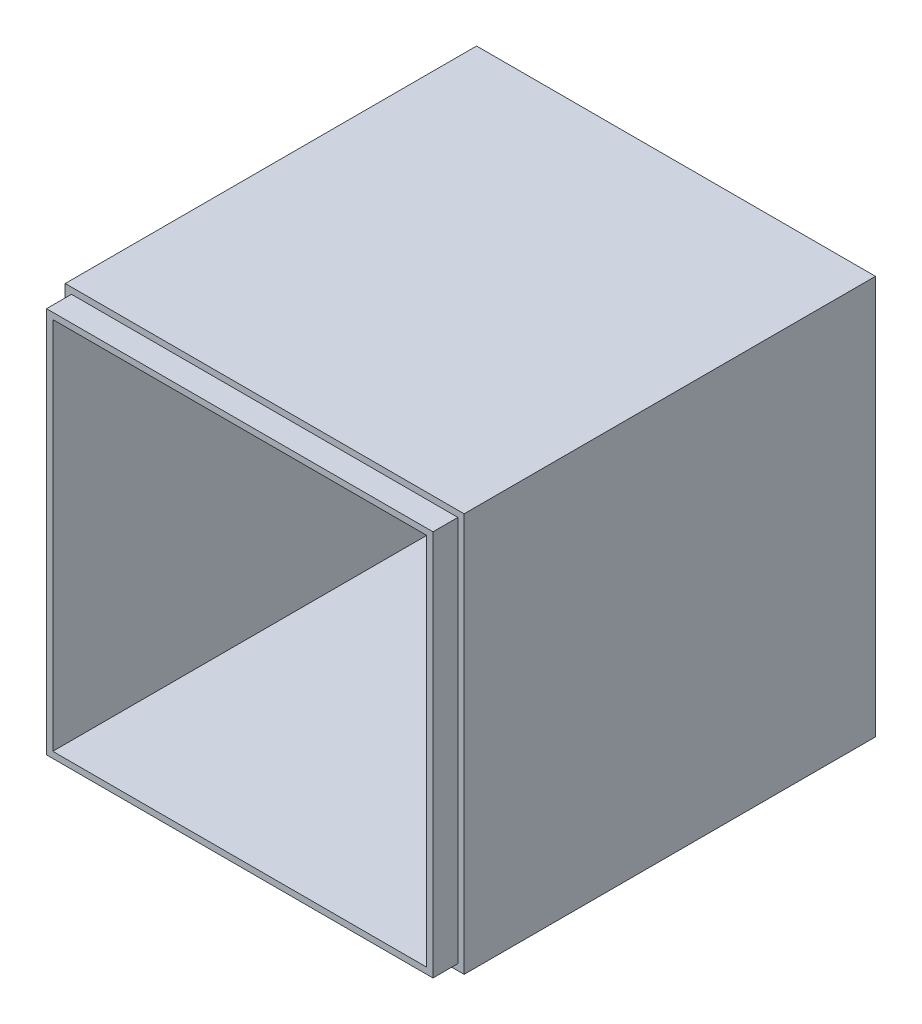
ISO-10303-21;
HEADER;
FILE_DESCRIPTION(('STEP AP214'),'2;1');
FILE_NAME('part.step','',(''),(''),'','','');
FILE_SCHEMA(('AUTOMOTIVE_DESIGN { 1 0 10303 214 1 1 1 1 }'));
ENDSEC;
DATA;
#1=APPLICATION_CONTEXT('core data for automotive mechanical design processes');
#2=APPLICATION_PROTOCOL_DEFINITION('international standard','automotive_design',2000,#1);
#3=PRODUCT_CONTEXT('',#1,'mechanical');
#4=PRODUCT('Part','Part','',(#3));
#5=PRODUCT_RELATED_PRODUCT_CATEGORY('part','',(#4));
#6=PRODUCT_DEFINITION_FORMATION('','',#4);
#7=PRODUCT_DEFINITION_CONTEXT('part definition',#1,'design');
#8=PRODUCT_DEFINITION('design','',#6,#7);
#9=PRODUCT_DEFINITION_SHAPE('','',#8);
#10=(LENGTH_UNIT() NAMED_UNIT(*) SI_UNIT(.MILLI.,.METRE.));
#11=(NAMED_UNIT(*) PLANE_ANGLE_UNIT() SI_UNIT($,.RADIAN.));
#12=(NAMED_UNIT(*) SI_UNIT($,.STERADIAN.) SOLID_ANGLE_UNIT());
#13=UNCERTAINTY_MEASURE_WITH_UNIT(LENGTH_MEASURE(1.E-05),#10,'distance_accuracy_value','');
#14=(GEOMETRIC_REPRESENTATION_CONTEXT(3) GLOBAL_UNCERTAINTY_ASSIGNED_CONTEXT((#13)) GLOBAL_UNIT_ASSIGNED_CONTEXT((#10,
#11,#12)) REPRESENTATION_CONTEXT('',''));
#15=CARTESIAN_POINT('',(0.,0.,0.));
#16=DIRECTION('',(0.,0.,1.));
#17=DIRECTION('',(1.,0.,0.));
#18=AXIS2_PLACEMENT_3D('',#15,#16,#17);
#19=CARTESIAN_POINT('',(0.,0.,88.9));
#20=DIRECTION('',(0.,0.,1.));
#21=DIRECTION('',(1.,0.,0.));
#22=AXIS2_PLACEMENT_3D('',#19,#20,#21);
#23=PLANE('',#22);
#24=DIRECTION('',(0.,1.,0.));
#25=VECTOR('',#24,1.);
#26=CARTESIAN_POINT('',(38.1,40.64,88.9));
#27=LINE('',#26,#25);
#28=CARTESIAN_POINT('',(38.1,-38.1,88.9));
#29=VERTEX_POINT('',#28);
#30=CARTESIAN_POINT('',(38.1,38.1,88.9));
#31=VERTEX_POINT('',#30);
#32=EDGE_CURVE('E191',#29,#31,#27,.T.);
#33=ORIENTED_EDGE('',*,*,#32,.F.);
#34=DIRECTION('',(1.,0.,0.));
#35=VECTOR('',#34,1.);
#36=CARTESIAN_POINT('',(-40.64,-38.1,88.9));
#37=LINE('',#36,#35);
#38=CARTESIAN_POINT('',(-38.1,-38.1,88.9));
#39=VERTEX_POINT('',#38);
#40=EDGE_CURVE('E181',#39,#29,#37,.T.);
#41=ORIENTED_EDGE('',*,*,#40,.F.);
#42=DIRECTION('',(0.,-1.,0.));
#43=VECTOR('',#42,1.);
#44=CARTESIAN_POINT('',(-38.1,40.64,88.9));
#45=LINE('',#44,#43);
#46=CARTESIAN_POINT('',(-38.1,38.1,88.9));
#47=VERTEX_POINT('',#46);
#48=EDGE_CURVE('E195',#47,#39,#45,.T.);
#49=ORIENTED_EDGE('',*,*,#48,.F.);
#50=DIRECTION('',(-1.,0.,0.));
#51=VECTOR('',#50,1.);
#52=CARTESIAN_POINT('',(-40.64,38.1,88.9));
#53=LINE('',#52,#51);
#54=EDGE_CURVE('E193',#31,#47,#53,.T.);
#55=ORIENTED_EDGE('',*,*,#54,.F.);
#56=EDGE_LOOP('',(#33,#41,#49,#55));
#57=FACE_BOUND('',#56,.T.);
#58=DIRECTION('',(0.,-1.,0.));
#59=VECTOR('',#58,1.);
#60=CARTESIAN_POINT('',(-39.37,39.37,88.9));
#61=LINE('',#60,#59);
#62=CARTESIAN_POINT('',(-39.37,39.37,88.9));
#63=VERTEX_POINT('',#62);
#64=CARTESIAN_POINT('',(-39.37,-39.37,88.9));
#65=VERTEX_POINT('',#64);
#66=EDGE_CURVE('E148',#63,#65,#61,.T.);
#67=ORIENTED_EDGE('',*,*,#66,.T.);
#68=DIRECTION('',(1.,0.,0.));
#69=VECTOR('',#68,1.);
#70=CARTESIAN_POINT('',(-39.37,-39.37,88.9));
#71=LINE('',#70,#69);
#72=CARTESIAN_POINT('',(39.37,-39.37,88.9));
#73=VERTEX_POINT('',#72);
#74=EDGE_CURVE('E155',#65,#73,#71,.T.);
#75=ORIENTED_EDGE('',*,*,#74,.T.);
#76=DIRECTION('',(0.,1.,0.));
#77=VECTOR('',#76,1.);
#78=CARTESIAN_POINT('',(39.37,-39.37,88.9));
#79=LINE('',#78,#77);
#80=CARTESIAN_POINT('',(39.37,39.37,88.9));
#81=VERTEX_POINT('',#80);
#82=EDGE_CURVE('E129',#73,#81,#79,.T.);
#83=ORIENTED_EDGE('',*,*,#82,.T.);
#84=DIRECTION('',(-1.,0.,0.));
#85=VECTOR('',#84,1.);
#86=CARTESIAN_POINT('',(39.37,39.37,88.9));
#87=LINE('',#86,#85);
#88=EDGE_CURVE('E57',#81,#63,#87,.T.);
#89=ORIENTED_EDGE('',*,*,#88,.T.);
#90=EDGE_LOOP('',(#67,#75,#83,#89));
#91=FACE_BOUND('',#90,.T.);
#92=ADVANCED_FACE('F35',(#57,#91),#23,.T.);
#93=CARTESIAN_POINT('',(38.1,40.64,88.9));
#94=DIRECTION('',(-1.,0.,0.));
#95=DIRECTION('',(0.,-1.,0.));
#96=AXIS2_PLACEMENT_3D('',#93,#94,#95);
#97=PLANE('',#96);
#98=DIRECTION('',(0.,1.,0.));
#99=VECTOR('',#98,1.);
#100=CARTESIAN_POINT('',(38.1,40.64,2.54));
#101=LINE('',#100,#99);
#102=CARTESIAN_POINT('',(38.1,-38.1,2.54));
#103=VERTEX_POINT('',#102);
#104=CARTESIAN_POINT('',(38.1,38.1,2.54));
#105=VERTEX_POINT('',#104);
#106=EDGE_CURVE('E168',#103,#105,#101,.T.);
#107=ORIENTED_EDGE('',*,*,#106,.F.);
#108=DIRECTION('',(0.,0.,-1.));
#109=VECTOR('',#108,1.);
#110=CARTESIAN_POINT('',(38.1,-38.1,88.9));
#111=LINE('',#110,#109);
#112=EDGE_CURVE('E177',#29,#103,#111,.T.);
#113=ORIENTED_EDGE('',*,*,#112,.F.);
#114=ORIENTED_EDGE('',*,*,#32,.T.);
#115=DIRECTION('',(0.,0.,-1.));
#116=VECTOR('',#115,1.);
#117=CARTESIAN_POINT('',(38.1,38.1,88.9));
#118=LINE('',#117,#116);
#119=EDGE_CURVE('E172',#31,#105,#118,.T.);
#120=ORIENTED_EDGE('',*,*,#119,.T.);
#121=EDGE_LOOP('',(#107,#113,#114,#120));
#122=FACE_BOUND('',#121,.T.);
#123=ADVANCED_FACE('F242',(#122),#97,.T.);
#124=CARTESIAN_POINT('',(-40.64,38.1,88.9));
#125=DIRECTION('',(0.,-1.,0.));
#126=DIRECTION('',(0.,0.,-1.));
#127=AXIS2_PLACEMENT_3D('',#124,#125,#126);
#128=PLANE('',#127);
#129=DIRECTION('',(-1.,0.,0.));
#130=VECTOR('',#129,1.);
#131=CARTESIAN_POINT('',(-40.64,38.1,2.54));
#132=LINE('',#131,#130);
#133=CARTESIAN_POINT('',(-38.1,38.1,2.54));
#134=VERTEX_POINT('',#133);
#135=EDGE_CURVE('E171',#105,#134,#132,.T.);
#136=ORIENTED_EDGE('',*,*,#135,.F.);
#137=ORIENTED_EDGE('',*,*,#119,.F.);
#138=ORIENTED_EDGE('',*,*,#54,.T.);
#139=DIRECTION('',(0.,0.,-1.));
#140=VECTOR('',#139,1.);
#141=CARTESIAN_POINT('',(-38.1,38.1,88.9));
#142=LINE('',#141,#140);
#143=EDGE_CURVE('E176',#47,#134,#142,.T.);
#144=ORIENTED_EDGE('',*,*,#143,.T.);
#145=EDGE_LOOP('',(#136,#137,#138,#144));
#146=FACE_BOUND('',#145,.T.);
#147=ADVANCED_FACE('F248',(#146),#128,.T.);
#148=CARTESIAN_POINT('',(-38.1,40.64,88.9));
#149=DIRECTION('',(1.,0.,0.));
#150=DIRECTION('',(0.,1.,0.));
#151=AXIS2_PLACEMENT_3D('',#148,#149,#150);
#152=PLANE('',#151);
#153=DIRECTION('',(0.,-1.,0.));
#154=VECTOR('',#153,1.);
#155=CARTESIAN_POINT('',(-38.1,40.64,2.54));
#156=LINE('',#155,#154);
#157=CARTESIAN_POINT('',(-38.1,-38.1,2.54));
#158=VERTEX_POINT('',#157);
#159=EDGE_CURVE('E183',#134,#158,#156,.T.);
#160=ORIENTED_EDGE('',*,*,#159,.F.);
#161=ORIENTED_EDGE('',*,*,#143,.F.);
#162=ORIENTED_EDGE('',*,*,#48,.T.);
#163=DIRECTION('',(0.,0.,-1.));
#164=VECTOR('',#163,1.);
#165=CARTESIAN_POINT('',(-38.1,-38.1,88.9));
#166=LINE('',#165,#164);
#167=EDGE_CURVE('E180',#39,#158,#166,.T.);
#168=ORIENTED_EDGE('',*,*,#167,.T.);
#169=EDGE_LOOP('',(#160,#161,#162,#168));
#170=FACE_BOUND('',#169,.T.);
#171=ADVANCED_FACE('F276',(#170),#152,.T.);
#172=CARTESIAN_POINT('',(-40.64,-38.1,88.9));
#173=DIRECTION('',(0.,1.,0.));
#174=DIRECTION('',(0.,0.,1.));
#175=AXIS2_PLACEMENT_3D('',#172,#173,#174);
#176=PLANE('',#175);
#177=DIRECTION('',(1.,0.,0.));
#178=VECTOR('',#177,1.);
#179=CARTESIAN_POINT('',(-40.64,-38.1,2.54));
#180=LINE('',#179,#178);
#181=EDGE_CURVE('E187',#158,#103,#180,.T.);
#182=ORIENTED_EDGE('',*,*,#181,.F.);
#183=ORIENTED_EDGE('',*,*,#167,.F.);
#184=ORIENTED_EDGE('',*,*,#40,.T.);
#185=ORIENTED_EDGE('',*,*,#112,.T.);
#186=EDGE_LOOP('',(#182,#183,#184,#185));
#187=FACE_BOUND('',#186,.T.);
#188=ADVANCED_FACE('F279',(#187),#176,.T.);
#189=CARTESIAN_POINT('',(0.,0.,2.54));
#190=DIRECTION('',(0.,0.,1.));
#191=DIRECTION('',(1.,0.,0.));
#192=AXIS2_PLACEMENT_3D('',#189,#190,#191);
#193=PLANE('',#192);
#194=ORIENTED_EDGE('',*,*,#106,.T.);
#195=ORIENTED_EDGE('',*,*,#135,.T.);
#196=ORIENTED_EDGE('',*,*,#159,.T.);
#197=ORIENTED_EDGE('',*,*,#181,.T.);
#198=EDGE_LOOP('',(#194,#195,#196,#197));
#199=FACE_BOUND('',#198,.T.);
#200=ADVANCED_FACE('F255',(#199),#193,.T.);
#201=CARTESIAN_POINT('',(0.,0.,83.82));
#202=DIRECTION('',(0.,0.,1.));
#203=DIRECTION('',(1.,0.,0.));
#204=AXIS2_PLACEMENT_3D('',#201,#202,#203);
#205=PLANE('',#204);
#206=DIRECTION('',(0.,-1.,0.));
#207=VECTOR('',#206,1.);
#208=CARTESIAN_POINT('',(-39.37,39.37,83.82));
#209=LINE('',#208,#207);
#210=CARTESIAN_POINT('',(-39.37,39.37,83.82));
#211=VERTEX_POINT('',#210);
#212=CARTESIAN_POINT('',(-39.37,-39.37,83.82));
#213=VERTEX_POINT('',#212);
#214=EDGE_CURVE('E135',#211,#213,#209,.T.);
#215=ORIENTED_EDGE('',*,*,#214,.F.);
#216=DIRECTION('',(-1.,0.,0.));
#217=VECTOR('',#216,1.);
#218=CARTESIAN_POINT('',(39.37,39.37,83.82));
#219=LINE('',#218,#217);
#220=CARTESIAN_POINT('',(39.37,39.37,83.82));
#221=VERTEX_POINT('',#220);
#222=EDGE_CURVE('E144',#221,#211,#219,.T.);
#223=ORIENTED_EDGE('',*,*,#222,.F.);
#224=DIRECTION('',(0.,1.,0.));
#225=VECTOR('',#224,1.);
#226=CARTESIAN_POINT('',(39.37,-39.37,83.82));
#227=LINE('',#226,#225);
#228=CARTESIAN_POINT('',(39.37,-39.37,83.82));
#229=VERTEX_POINT('',#228);
#230=EDGE_CURVE('E127',#229,#221,#227,.T.);
#231=ORIENTED_EDGE('',*,*,#230,.F.);
#232=DIRECTION('',(1.,0.,0.));
#233=VECTOR('',#232,1.);
#234=CARTESIAN_POINT('',(-39.37,-39.37,83.82));
#235=LINE('',#234,#233);
#236=EDGE_CURVE('E141',#213,#229,#235,.T.);
#237=ORIENTED_EDGE('',*,*,#236,.F.);
#238=EDGE_LOOP('',(#215,#223,#231,#237));
#239=FACE_BOUND('',#238,.T.);
#240=DIRECTION('',(0.,1.,0.));
#241=VECTOR('',#240,1.);
#242=CARTESIAN_POINT('',(40.64,40.64,83.82));
#243=LINE('',#242,#241);
#244=CARTESIAN_POINT('',(40.64,-40.64,83.82));
#245=VERTEX_POINT('',#244);
#246=CARTESIAN_POINT('',(40.64,40.64,83.82));
#247=VERTEX_POINT('',#246);
#248=EDGE_CURVE('E166',#245,#247,#243,.T.);
#249=ORIENTED_EDGE('',*,*,#248,.T.);
#250=DIRECTION('',(-1.,0.,0.));
#251=VECTOR('',#250,1.);
#252=CARTESIAN_POINT('',(-40.64,40.64,83.82));
#253=LINE('',#252,#251);
#254=CARTESIAN_POINT('',(-40.64,40.64,83.82));
#255=VERTEX_POINT('',#254);
#256=EDGE_CURVE('E164',#247,#255,#253,.T.);
#257=ORIENTED_EDGE('',*,*,#256,.T.);
#258=DIRECTION('',(0.,-1.,0.));
#259=VECTOR('',#258,1.);
#260=CARTESIAN_POINT('',(-40.64,40.64,83.82));
#261=LINE('',#260,#259);
#262=CARTESIAN_POINT('',(-40.64,-40.64,83.82));
#263=VERTEX_POINT('',#262);
#264=EDGE_CURVE('E49',#255,#263,#261,.T.);
#265=ORIENTED_EDGE('',*,*,#264,.T.);
#266=DIRECTION('',(1.,0.,0.));
#267=VECTOR('',#266,1.);
#268=CARTESIAN_POINT('',(-40.64,-40.64,83.82));
#269=LINE('',#268,#267);
#270=EDGE_CURVE('E11',#263,#245,#269,.T.);
#271=ORIENTED_EDGE('',*,*,#270,.T.);
#272=EDGE_LOOP('',(#249,#257,#265,#271));
#273=FACE_BOUND('',#272,.T.);
#274=ADVANCED_FACE('F140',(#239,#273),#205,.T.);
#275=CARTESIAN_POINT('',(-39.37,-39.37,83.82));
#276=DIRECTION('',(0.,-1.,0.));
#277=DIRECTION('',(0.,0.,-1.));
#278=AXIS2_PLACEMENT_3D('',#275,#276,#277);
#279=PLANE('',#278);
#280=ORIENTED_EDGE('',*,*,#74,.F.);
#281=DIRECTION('',(0.,0.,1.));
#282=VECTOR('',#281,1.);
#283=CARTESIAN_POINT('',(-39.37,-39.37,83.82));
#284=LINE('',#283,#282);
#285=EDGE_CURVE('E147',#213,#65,#284,.T.);
#286=ORIENTED_EDGE('',*,*,#285,.F.);
#287=ORIENTED_EDGE('',*,*,#236,.T.);
#288=DIRECTION('',(0.,0.,1.));
#289=VECTOR('',#288,1.);
#290=CARTESIAN_POINT('',(39.37,-39.37,83.82));
#291=LINE('',#290,#289);
#292=EDGE_CURVE('E124',#229,#73,#291,.T.);
#293=ORIENTED_EDGE('',*,*,#292,.T.);
#294=EDGE_LOOP('',(#280,#286,#287,#293));
#295=FACE_BOUND('',#294,.T.);
#296=ADVANCED_FACE('F146',(#295),#279,.T.);
#297=CARTESIAN_POINT('',(-39.37,39.37,83.82));
#298=DIRECTION('',(-1.,0.,0.));
#299=DIRECTION('',(0.,-1.,0.));
#300=AXIS2_PLACEMENT_3D('',#297,#298,#299);
#301=PLANE('',#300);
#302=ORIENTED_EDGE('',*,*,#66,.F.);
#303=DIRECTION('',(0.,0.,1.));
#304=VECTOR('',#303,1.);
#305=CARTESIAN_POINT('',(-39.37,39.37,83.82));
#306=LINE('',#305,#304);
#307=EDGE_CURVE('E160',#211,#63,#306,.T.);
#308=ORIENTED_EDGE('',*,*,#307,.F.);
#309=ORIENTED_EDGE('',*,*,#214,.T.);
#310=ORIENTED_EDGE('',*,*,#285,.T.);
#311=EDGE_LOOP('',(#302,#308,#309,#310));
#312=FACE_BOUND('',#311,.T.);
#313=ADVANCED_FACE('F266',(#312),#301,.T.);
#314=CARTESIAN_POINT('',(39.37,39.37,83.82));
#315=DIRECTION('',(0.,1.,0.));
#316=DIRECTION('',(0.,0.,1.));
#317=AXIS2_PLACEMENT_3D('',#314,#315,#316);
#318=PLANE('',#317);
#319=ORIENTED_EDGE('',*,*,#88,.F.);
#320=DIRECTION('',(0.,0.,1.));
#321=VECTOR('',#320,1.);
#322=CARTESIAN_POINT('',(39.37,39.37,83.82));
#323=LINE('',#322,#321);
#324=EDGE_CURVE('E134',#221,#81,#323,.T.);
#325=ORIENTED_EDGE('',*,*,#324,.F.);
#326=ORIENTED_EDGE('',*,*,#222,.T.);
#327=ORIENTED_EDGE('',*,*,#307,.T.);
#328=EDGE_LOOP('',(#319,#325,#326,#327));
#329=FACE_BOUND('',#328,.T.);
#330=ADVANCED_FACE('F261',(#329),#318,.T.);
#331=CARTESIAN_POINT('',(39.37,-39.37,83.82));
#332=DIRECTION('',(1.,0.,0.));
#333=DIRECTION('',(0.,1.,0.));
#334=AXIS2_PLACEMENT_3D('',#331,#332,#333);
#335=PLANE('',#334);
#336=ORIENTED_EDGE('',*,*,#82,.F.);
#337=ORIENTED_EDGE('',*,*,#292,.F.);
#338=ORIENTED_EDGE('',*,*,#230,.T.);
#339=ORIENTED_EDGE('',*,*,#324,.T.);
#340=EDGE_LOOP('',(#336,#337,#338,#339));
#341=FACE_BOUND('',#340,.T.);
#342=ADVANCED_FACE('F126',(#341),#335,.T.);
#343=CARTESIAN_POINT('',(0.,0.,0.));
#344=DIRECTION('',(0.,0.,1.));
#345=DIRECTION('',(1.,0.,0.));
#346=AXIS2_PLACEMENT_3D('',#343,#344,#345);
#347=PLANE('',#346);
#348=DIRECTION('',(0.,1.,0.));
#349=VECTOR('',#348,1.);
#350=CARTESIAN_POINT('',(40.64,40.64,0.));
#351=LINE('',#350,#349);
#352=CARTESIAN_POINT('',(40.64,-40.64,0.));
#353=VERTEX_POINT('',#352);
#354=CARTESIAN_POINT('',(40.64,40.64,0.));
#355=VERTEX_POINT('',#354);
#356=EDGE_CURVE('E175',#353,#355,#351,.T.);
#357=ORIENTED_EDGE('',*,*,#356,.F.);
#358=DIRECTION('',(1.,0.,0.));
#359=VECTOR('',#358,1.);
#360=CARTESIAN_POINT('',(-40.64,-40.64,0.));
#361=LINE('',#360,#359);
#362=CARTESIAN_POINT('',(-40.64,-40.64,0.));
#363=VERTEX_POINT('',#362);
#364=EDGE_CURVE('E207',#363,#353,#361,.T.);
#365=ORIENTED_EDGE('',*,*,#364,.F.);
#366=DIRECTION('',(0.,-1.,0.));
#367=VECTOR('',#366,1.);
#368=CARTESIAN_POINT('',(-40.64,40.64,0.));
#369=LINE('',#368,#367);
#370=CARTESIAN_POINT('',(-40.64,40.64,0.));
#371=VERTEX_POINT('',#370);
#372=EDGE_CURVE('E204',#371,#363,#369,.T.);
#373=ORIENTED_EDGE('',*,*,#372,.F.);
#374=DIRECTION('',(-1.,0.,0.));
#375=VECTOR('',#374,1.);
#376=CARTESIAN_POINT('',(-40.64,40.64,0.));
#377=LINE('',#376,#375);
#378=EDGE_CURVE('E201',#355,#371,#377,.T.);
#379=ORIENTED_EDGE('',*,*,#378,.F.);
#380=EDGE_LOOP('',(#357,#365,#373,#379));
#381=FACE_BOUND('',#380,.T.);
#382=ADVANCED_FACE('F226',(#381),#347,.F.);
#383=CARTESIAN_POINT('',(-40.64,-40.64,88.9));
#384=DIRECTION('',(0.,1.,0.));
#385=DIRECTION('',(0.,0.,1.));
#386=AXIS2_PLACEMENT_3D('',#383,#384,#385);
#387=PLANE('',#386);
#388=ORIENTED_EDGE('',*,*,#270,.F.);
#389=DIRECTION('',(0.,0.,-1.));
#390=VECTOR('',#389,1.);
#391=CARTESIAN_POINT('',(-40.64,-40.64,88.9));
#392=LINE('',#391,#390);
#393=EDGE_CURVE('E212',#263,#363,#392,.T.);
#394=ORIENTED_EDGE('',*,*,#393,.T.);
#395=ORIENTED_EDGE('',*,*,#364,.T.);
#396=DIRECTION('',(0.,0.,-1.));
#397=VECTOR('',#396,1.);
#398=CARTESIAN_POINT('',(40.64,-40.64,88.9));
#399=LINE('',#398,#397);
#400=EDGE_CURVE('E210',#245,#353,#399,.T.);
#401=ORIENTED_EDGE('',*,*,#400,.F.);
#402=EDGE_LOOP('',(#388,#394,#395,#401));
#403=FACE_BOUND('',#402,.T.);
#404=ADVANCED_FACE('F230',(#403),#387,.F.);
#405=CARTESIAN_POINT('',(-40.64,40.64,88.9));
#406=DIRECTION('',(1.,0.,0.));
#407=DIRECTION('',(0.,1.,0.));
#408=AXIS2_PLACEMENT_3D('',#405,#406,#407);
#409=PLANE('',#408);
#410=ORIENTED_EDGE('',*,*,#264,.F.);
#411=DIRECTION('',(0.,0.,-1.));
#412=VECTOR('',#411,1.);
#413=CARTESIAN_POINT('',(-40.64,40.64,88.9));
#414=LINE('',#413,#412);
#415=EDGE_CURVE('E214',#255,#371,#414,.T.);
#416=ORIENTED_EDGE('',*,*,#415,.T.);
#417=ORIENTED_EDGE('',*,*,#372,.T.);
#418=ORIENTED_EDGE('',*,*,#393,.F.);
#419=EDGE_LOOP('',(#410,#416,#417,#418));
#420=FACE_BOUND('',#419,.T.);
#421=ADVANCED_FACE('F233',(#420),#409,.F.);
#422=CARTESIAN_POINT('',(-40.64,40.64,88.9));
#423=DIRECTION('',(0.,-1.,0.));
#424=DIRECTION('',(0.,0.,-1.));
#425=AXIS2_PLACEMENT_3D('',#422,#423,#424);
#426=PLANE('',#425);
#427=ORIENTED_EDGE('',*,*,#256,.F.);
#428=DIRECTION('',(0.,0.,-1.));
#429=VECTOR('',#428,1.);
#430=CARTESIAN_POINT('',(40.64,40.64,88.9));
#431=LINE('',#430,#429);
#432=EDGE_CURVE('E43',#247,#355,#431,.T.);
#433=ORIENTED_EDGE('',*,*,#432,.T.);
#434=ORIENTED_EDGE('',*,*,#378,.T.);
#435=ORIENTED_EDGE('',*,*,#415,.F.);
#436=EDGE_LOOP('',(#427,#433,#434,#435));
#437=FACE_BOUND('',#436,.T.);
#438=ADVANCED_FACE('F219',(#437),#426,.F.);
#439=CARTESIAN_POINT('',(40.64,40.64,88.9));
#440=DIRECTION('',(-1.,0.,0.));
#441=DIRECTION('',(0.,-1.,0.));
#442=AXIS2_PLACEMENT_3D('',#439,#440,#441);
#443=PLANE('',#442);
#444=ORIENTED_EDGE('',*,*,#248,.F.);
#445=ORIENTED_EDGE('',*,*,#400,.T.);
#446=ORIENTED_EDGE('',*,*,#356,.T.);
#447=ORIENTED_EDGE('',*,*,#432,.F.);
#448=EDGE_LOOP('',(#444,#445,#446,#447));
#449=FACE_BOUND('',#448,.T.);
#450=ADVANCED_FACE('F37',(#449),#443,.F.);
#451=CLOSED_SHELL('',(#92,#123,#147,#171,#188,#200,#274,#296,#313,#330,#342,#382,#404,#421,#438,#450));
#452=MANIFOLD_SOLID_BREP('B2',#451);
#453=ADVANCED_BREP_SHAPE_REPRESENTATION('',(#18,#452),#14);
#454=SHAPE_DEFINITION_REPRESENTATION(#9,#453);
ENDSEC;
END-ISO-10303-21;
